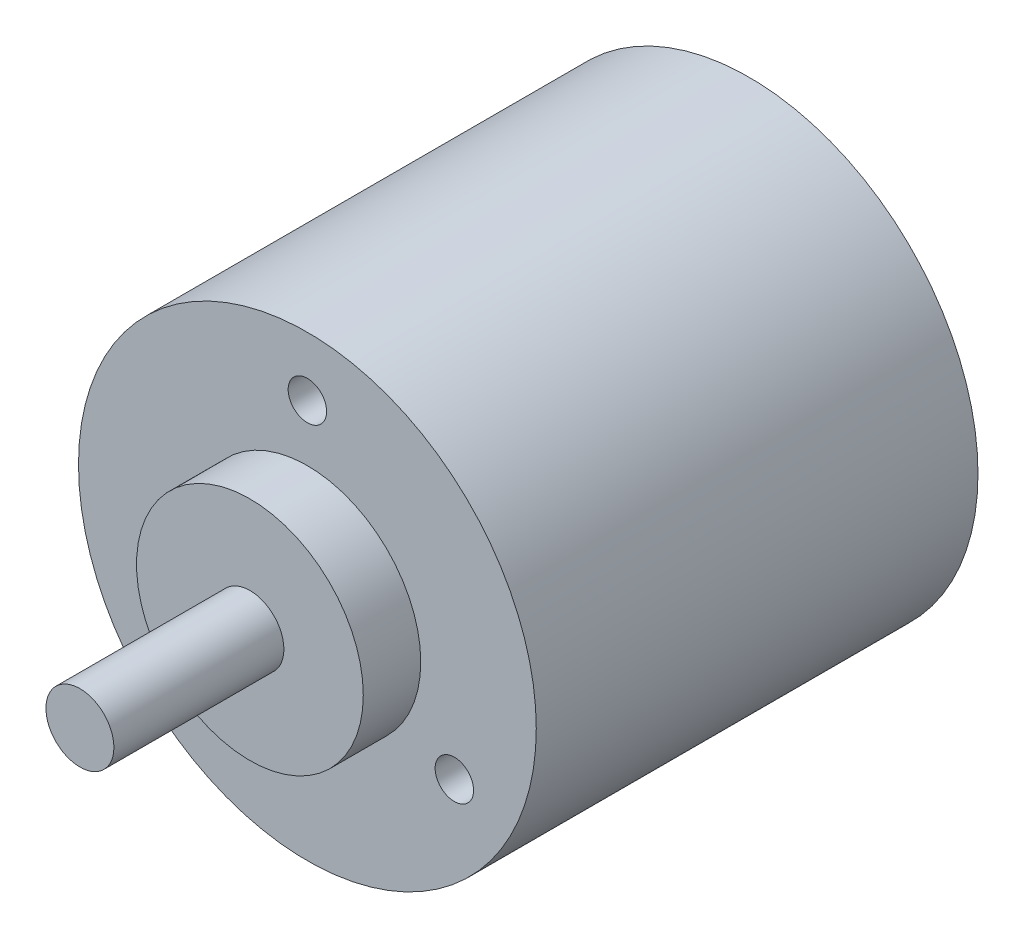
ISO-10303-21;
HEADER;
FILE_DESCRIPTION(('STEP AP214'),'2;1');
FILE_NAME('part.step','',(''),(''),'','','');
FILE_SCHEMA(('AUTOMOTIVE_DESIGN { 1 0 10303 214 1 1 1 1 }'));
ENDSEC;
DATA;
#1=APPLICATION_CONTEXT('core data for automotive mechanical design processes');
#2=APPLICATION_PROTOCOL_DEFINITION('international standard','automotive_design',2000,#1);
#3=PRODUCT_CONTEXT('',#1,'mechanical');
#4=PRODUCT('Part','Part','',(#3));
#5=PRODUCT_RELATED_PRODUCT_CATEGORY('part','',(#4));
#6=PRODUCT_DEFINITION_FORMATION('','',#4);
#7=PRODUCT_DEFINITION_CONTEXT('part definition',#1,'design');
#8=PRODUCT_DEFINITION('design','',#6,#7);
#9=PRODUCT_DEFINITION_SHAPE('','',#8);
#10=(LENGTH_UNIT() NAMED_UNIT(*) SI_UNIT(.MILLI.,.METRE.));
#11=(NAMED_UNIT(*) PLANE_ANGLE_UNIT() SI_UNIT($,.RADIAN.));
#12=(NAMED_UNIT(*) SI_UNIT($,.STERADIAN.) SOLID_ANGLE_UNIT());
#13=UNCERTAINTY_MEASURE_WITH_UNIT(LENGTH_MEASURE(1.E-05),#10,'distance_accuracy_value','');
#14=(GEOMETRIC_REPRESENTATION_CONTEXT(3) GLOBAL_UNCERTAINTY_ASSIGNED_CONTEXT((#13)) GLOBAL_UNIT_ASSIGNED_CONTEXT((#10,
#11,#12)) REPRESENTATION_CONTEXT('',''));
#15=CARTESIAN_POINT('',(0.,0.,0.));
#16=DIRECTION('',(0.,0.,1.));
#17=DIRECTION('',(1.,0.,0.));
#18=AXIS2_PLACEMENT_3D('',#15,#16,#17);
#19=CARTESIAN_POINT('',(0.,0.,24.5999));
#20=DIRECTION('',(0.,0.,1.));
#21=DIRECTION('',(1.,0.,0.));
#22=AXIS2_PLACEMENT_3D('',#19,#20,#21);
#23=PLANE('',#22);
#24=CARTESIAN_POINT('',(0.,0.,24.5999));
#25=DIRECTION('',(0.,0.,1.));
#26=DIRECTION('',(1.,0.,0.));
#27=AXIS2_PLACEMENT_3D('',#24,#25,#26);
#28=CIRCLE('',#27,10.0203);
#29=CARTESIAN_POINT('',(10.0203,0.,24.5999));
#30=VERTEX_POINT('',#29);
#31=EDGE_CURVE('E85',#30,#30,#28,.T.);
#32=ORIENTED_EDGE('',*,*,#31,.T.);
#33=EDGE_LOOP('',(#32));
#34=FACE_BOUND('',#33,.T.);
#35=CARTESIAN_POINT('',(0.,0.,24.5999));
#36=DIRECTION('',(0.,0.,1.));
#37=DIRECTION('',(1.,0.,0.));
#38=AXIS2_PLACEMENT_3D('',#35,#36,#37);
#39=CIRCLE('',#38,3.00355);
#40=CARTESIAN_POINT('',(3.00355,0.,24.5999));
#41=VERTEX_POINT('',#40);
#42=EDGE_CURVE('E78',#41,#41,#39,.T.);
#43=ORIENTED_EDGE('',*,*,#42,.F.);
#44=EDGE_LOOP('',(#43));
#45=FACE_BOUND('',#44,.T.);
#46=ADVANCED_FACE('F33',(#34,#45),#23,.T.);
#47=CARTESIAN_POINT('',(0.,0.,19.5199));
#48=DIRECTION('',(0.,0.,1.));
#49=DIRECTION('',(1.,0.,0.));
#50=AXIS2_PLACEMENT_3D('',#47,#48,#49);
#51=PLANE('',#50);
#52=CARTESIAN_POINT('',(0.,15.,19.5199));
#53=DIRECTION('',(0.,0.,1.));
#54=DIRECTION('',(1.,0.,0.));
#55=AXIS2_PLACEMENT_3D('',#52,#53,#54);
#56=CIRCLE('',#55,1.69999999999999);
#57=CARTESIAN_POINT('',(1.69999999999999,15.,19.5199));
#58=VERTEX_POINT('',#57);
#59=EDGE_CURVE('E62',#58,#58,#56,.T.);
#60=ORIENTED_EDGE('',*,*,#59,.F.);
#61=EDGE_LOOP('',(#60));
#62=FACE_BOUND('',#61,.T.);
#63=CARTESIAN_POINT('',(12.9903810567675,-7.49999999999945,19.5199));
#64=DIRECTION('',(0.,0.,1.));
#65=DIRECTION('',(1.,0.,0.));
#66=AXIS2_PLACEMENT_3D('',#63,#64,#65);
#67=CIRCLE('',#66,1.69999999999999);
#68=CARTESIAN_POINT('',(14.6903810567675,-7.49999999999945,19.5199));
#69=VERTEX_POINT('',#68);
#70=EDGE_CURVE('E61',#69,#69,#67,.T.);
#71=ORIENTED_EDGE('',*,*,#70,.F.);
#72=EDGE_LOOP('',(#71));
#73=FACE_BOUND('',#72,.T.);
#74=CARTESIAN_POINT('',(-12.9903810567656,-7.50000000000055,19.5199));
#75=DIRECTION('',(0.,0.,1.));
#76=DIRECTION('',(1.,0.,0.));
#77=AXIS2_PLACEMENT_3D('',#74,#75,#76);
#78=CIRCLE('',#77,1.69999999999999);
#79=CARTESIAN_POINT('',(-11.2903810567656,-7.50000000000055,19.5199));
#80=VERTEX_POINT('',#79);
#81=EDGE_CURVE('E72',#80,#80,#78,.T.);
#82=ORIENTED_EDGE('',*,*,#81,.F.);
#83=EDGE_LOOP('',(#82));
#84=FACE_BOUND('',#83,.T.);
#85=CARTESIAN_POINT('',(0.,0.,19.5199));
#86=DIRECTION('',(0.,0.,1.));
#87=DIRECTION('',(1.,0.,0.));
#88=AXIS2_PLACEMENT_3D('',#85,#86,#87);
#89=CIRCLE('',#88,20.2311);
#90=CARTESIAN_POINT('',(20.2311,0.,19.5199));
#91=VERTEX_POINT('',#90);
#92=EDGE_CURVE('E11',#91,#91,#89,.T.);
#93=ORIENTED_EDGE('',*,*,#92,.T.);
#94=EDGE_LOOP('',(#93));
#95=FACE_BOUND('',#94,.T.);
#96=CARTESIAN_POINT('',(0.,0.,19.5199));
#97=DIRECTION('',(0.,0.,1.));
#98=DIRECTION('',(1.,0.,0.));
#99=AXIS2_PLACEMENT_3D('',#96,#97,#98);
#100=CIRCLE('',#99,10.0203);
#101=CARTESIAN_POINT('',(10.0203,0.,19.5199));
#102=VERTEX_POINT('',#101);
#103=EDGE_CURVE('E82',#102,#102,#100,.T.);
#104=ORIENTED_EDGE('',*,*,#103,.F.);
#105=EDGE_LOOP('',(#104));
#106=FACE_BOUND('',#105,.T.);
#107=ADVANCED_FACE('F93',(#62,#73,#84,#95,#106),#51,.T.);
#108=CARTESIAN_POINT('',(0.,0.,19.5199));
#109=DIRECTION('',(0.,0.,-1.));
#110=DIRECTION('',(-1.,0.,0.));
#111=AXIS2_PLACEMENT_3D('',#108,#109,#110);
#112=CYLINDRICAL_SURFACE('',#111,20.2311);
#113=ORIENTED_EDGE('',*,*,#92,.F.);
#114=EDGE_LOOP('',(#113));
#115=FACE_BOUND('',#114,.T.);
#116=CARTESIAN_POINT('',(0.,0.,-19.5199));
#117=DIRECTION('',(0.,0.,1.));
#118=DIRECTION('',(1.,0.,0.));
#119=AXIS2_PLACEMENT_3D('',#116,#117,#118);
#120=CIRCLE('',#119,20.2311);
#121=CARTESIAN_POINT('',(20.2311,0.,-19.5199));
#122=VERTEX_POINT('',#121);
#123=EDGE_CURVE('E37',#122,#122,#120,.T.);
#124=ORIENTED_EDGE('',*,*,#123,.T.);
#125=EDGE_LOOP('',(#124));
#126=FACE_BOUND('',#125,.T.);
#127=ADVANCED_FACE('F35',(#115,#126),#112,.T.);
#128=CARTESIAN_POINT('',(0.,0.,-19.5199));
#129=DIRECTION('',(0.,0.,1.));
#130=DIRECTION('',(1.,0.,0.));
#131=AXIS2_PLACEMENT_3D('',#128,#129,#130);
#132=PLANE('',#131);
#133=ORIENTED_EDGE('',*,*,#123,.F.);
#134=EDGE_LOOP('',(#133));
#135=FACE_BOUND('',#134,.T.);
#136=ADVANCED_FACE('F101',(#135),#132,.F.);
#137=CARTESIAN_POINT('',(0.,0.,24.5999));
#138=DIRECTION('',(0.,0.,-1.));
#139=DIRECTION('',(-1.,0.,0.));
#140=AXIS2_PLACEMENT_3D('',#137,#138,#139);
#141=CYLINDRICAL_SURFACE('',#140,10.0203);
#142=ORIENTED_EDGE('',*,*,#31,.F.);
#143=EDGE_LOOP('',(#142));
#144=FACE_BOUND('',#143,.T.);
#145=ORIENTED_EDGE('',*,*,#103,.T.);
#146=EDGE_LOOP('',(#145));
#147=FACE_BOUND('',#146,.T.);
#148=ADVANCED_FACE('F91',(#144,#147),#141,.T.);
#149=CARTESIAN_POINT('',(0.,0.,39.624));
#150=DIRECTION('',(0.,0.,-1.));
#151=DIRECTION('',(-1.,0.,0.));
#152=AXIS2_PLACEMENT_3D('',#149,#150,#151);
#153=CYLINDRICAL_SURFACE('',#152,3.00355);
#154=CARTESIAN_POINT('',(0.,0.,39.624));
#155=DIRECTION('',(0.,0.,1.));
#156=DIRECTION('',(1.,0.,0.));
#157=AXIS2_PLACEMENT_3D('',#154,#155,#156);
#158=CIRCLE('',#157,3.00355);
#159=CARTESIAN_POINT('',(3.00355,0.,39.624));
#160=VERTEX_POINT('',#159);
#161=EDGE_CURVE('E79',#160,#160,#158,.T.);
#162=ORIENTED_EDGE('',*,*,#161,.F.);
#163=EDGE_LOOP('',(#162));
#164=FACE_BOUND('',#163,.T.);
#165=ORIENTED_EDGE('',*,*,#42,.T.);
#166=EDGE_LOOP('',(#165));
#167=FACE_BOUND('',#166,.T.);
#168=ADVANCED_FACE('F113',(#164,#167),#153,.T.);
#169=CARTESIAN_POINT('',(0.,0.,39.624));
#170=DIRECTION('',(0.,0.,1.));
#171=DIRECTION('',(1.,0.,0.));
#172=AXIS2_PLACEMENT_3D('',#169,#170,#171);
#173=PLANE('',#172);
#174=ORIENTED_EDGE('',*,*,#161,.T.);
#175=EDGE_LOOP('',(#174));
#176=FACE_BOUND('',#175,.T.);
#177=ADVANCED_FACE('F121',(#176),#173,.T.);
#178=CARTESIAN_POINT('',(-12.9903810567656,-7.50000000000055,12.5198886));
#179=DIRECTION('',(0.,0.,1.));
#180=DIRECTION('',(1.,0.,0.));
#181=AXIS2_PLACEMENT_3D('',#178,#179,#180);
#182=CONICAL_SURFACE('',#181,1.69999999999999,1.02974425867665);
#183=CARTESIAN_POINT('',(-12.9903810567656,-7.50000000000055,11.4984255476532));
#184=VERTEX_POINT('',#183);
#185=VERTEX_LOOP('',#184);
#186=FACE_BOUND('',#185,.T.);
#187=CARTESIAN_POINT('',(-12.9903810567656,-7.50000000000055,12.5198886));
#188=DIRECTION('',(0.,0.,1.));
#189=DIRECTION('',(1.,0.,0.));
#190=AXIS2_PLACEMENT_3D('',#187,#188,#189);
#191=CIRCLE('',#190,1.69999999999999);
#192=CARTESIAN_POINT('',(-11.2903810567656,-7.50000000000055,12.5198886));
#193=VERTEX_POINT('',#192);
#194=EDGE_CURVE('E75',#193,#193,#191,.T.);
#195=ORIENTED_EDGE('',*,*,#194,.T.);
#196=EDGE_LOOP('',(#195));
#197=FACE_BOUND('',#196,.T.);
#198=ADVANCED_FACE('F131',(#186,#197),#182,.F.);
#199=CARTESIAN_POINT('',(-12.9903810567656,-7.50000000000055,19.5199));
#200=DIRECTION('',(0.,0.,1.));
#201=DIRECTION('',(1.,0.,0.));
#202=AXIS2_PLACEMENT_3D('',#199,#200,#201);
#203=CYLINDRICAL_SURFACE('',#202,1.69999999999999);
#204=ORIENTED_EDGE('',*,*,#194,.F.);
#205=EDGE_LOOP('',(#204));
#206=FACE_BOUND('',#205,.T.);
#207=ORIENTED_EDGE('',*,*,#81,.T.);
#208=EDGE_LOOP('',(#207));
#209=FACE_BOUND('',#208,.T.);
#210=ADVANCED_FACE('F138',(#206,#209),#203,.F.);
#211=CARTESIAN_POINT('',(12.9903810567675,-7.49999999999945,12.5198886));
#212=DIRECTION('',(0.,0.,1.));
#213=DIRECTION('',(1.,0.,0.));
#214=AXIS2_PLACEMENT_3D('',#211,#212,#213);
#215=CONICAL_SURFACE('',#214,1.69999999999999,1.02974425867665);
#216=CARTESIAN_POINT('',(12.9903810567675,-7.49999999999945,11.4984255476532));
#217=VERTEX_POINT('',#216);
#218=VERTEX_LOOP('',#217);
#219=FACE_BOUND('',#218,.T.);
#220=CARTESIAN_POINT('',(12.9903810567675,-7.49999999999945,12.5198886));
#221=DIRECTION('',(0.,0.,1.));
#222=DIRECTION('',(1.,0.,0.));
#223=AXIS2_PLACEMENT_3D('',#220,#221,#222);
#224=CIRCLE('',#223,1.69999999999999);
#225=CARTESIAN_POINT('',(14.6903810567675,-7.49999999999945,12.5198886));
#226=VERTEX_POINT('',#225);
#227=EDGE_CURVE('E65',#226,#226,#224,.T.);
#228=ORIENTED_EDGE('',*,*,#227,.T.);
#229=EDGE_LOOP('',(#228));
#230=FACE_BOUND('',#229,.T.);
#231=ADVANCED_FACE('F141',(#219,#230),#215,.F.);
#232=CARTESIAN_POINT('',(12.9903810567675,-7.49999999999945,19.5199));
#233=DIRECTION('',(0.,0.,1.));
#234=DIRECTION('',(1.,0.,0.));
#235=AXIS2_PLACEMENT_3D('',#232,#233,#234);
#236=CYLINDRICAL_SURFACE('',#235,1.69999999999999);
#237=ORIENTED_EDGE('',*,*,#227,.F.);
#238=EDGE_LOOP('',(#237));
#239=FACE_BOUND('',#238,.T.);
#240=ORIENTED_EDGE('',*,*,#70,.T.);
#241=EDGE_LOOP('',(#240));
#242=FACE_BOUND('',#241,.T.);
#243=ADVANCED_FACE('F55',(#239,#242),#236,.F.);
#244=CARTESIAN_POINT('',(0.,15.,12.5198886));
#245=DIRECTION('',(0.,0.,1.));
#246=DIRECTION('',(1.,0.,0.));
#247=AXIS2_PLACEMENT_3D('',#244,#245,#246);
#248=CONICAL_SURFACE('',#247,1.69999999999999,1.02974425867665);
#249=CARTESIAN_POINT('',(0.,15.,11.4984255476532));
#250=VERTEX_POINT('',#249);
#251=VERTEX_LOOP('',#250);
#252=FACE_BOUND('',#251,.T.);
#253=CARTESIAN_POINT('',(0.,15.,12.5198886));
#254=DIRECTION('',(0.,0.,1.));
#255=DIRECTION('',(1.,0.,0.));
#256=AXIS2_PLACEMENT_3D('',#253,#254,#255);
#257=CIRCLE('',#256,1.69999999999999);
#258=CARTESIAN_POINT('',(1.69999999999999,15.,12.5198886));
#259=VERTEX_POINT('',#258);
#260=EDGE_CURVE('E59',#259,#259,#257,.T.);
#261=ORIENTED_EDGE('',*,*,#260,.T.);
#262=EDGE_LOOP('',(#261));
#263=FACE_BOUND('',#262,.T.);
#264=ADVANCED_FACE('F51',(#252,#263),#248,.F.);
#265=CARTESIAN_POINT('',(0.,15.,19.5199));
#266=DIRECTION('',(0.,0.,1.));
#267=DIRECTION('',(1.,0.,0.));
#268=AXIS2_PLACEMENT_3D('',#265,#266,#267);
#269=CYLINDRICAL_SURFACE('',#268,1.69999999999999);
#270=ORIENTED_EDGE('',*,*,#260,.F.);
#271=EDGE_LOOP('',(#270));
#272=FACE_BOUND('',#271,.T.);
#273=ORIENTED_EDGE('',*,*,#59,.T.);
#274=EDGE_LOOP('',(#273));
#275=FACE_BOUND('',#274,.T.);
#276=ADVANCED_FACE('F54',(#272,#275),#269,.F.);
#277=CLOSED_SHELL('',(#46,#107,#127,#136,#148,#168,#177,#198,#210,#231,#243,#264,#276));
#278=MANIFOLD_SOLID_BREP('B2',#277);
#279=ADVANCED_BREP_SHAPE_REPRESENTATION('',(#18,#278),#14);
#280=SHAPE_DEFINITION_REPRESENTATION(#9,#279);
ENDSEC;
END-ISO-10303-21;
